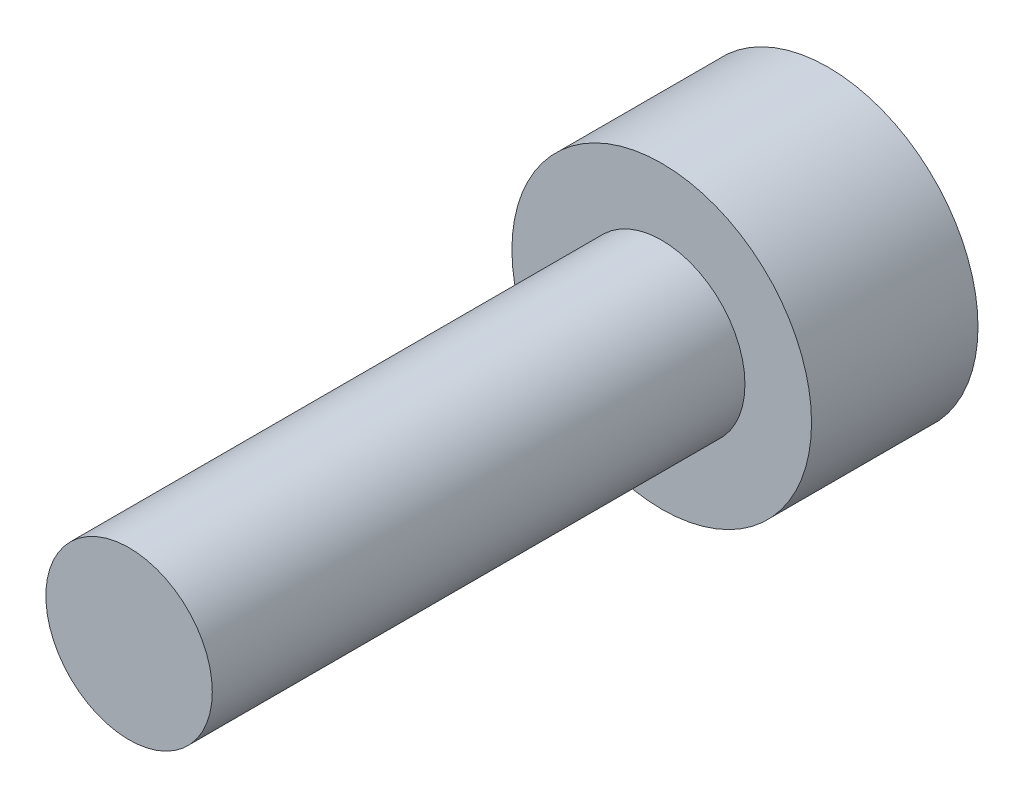
ISO-10303-21;
HEADER;
FILE_DESCRIPTION(('STEP AP214'),'2;1');
FILE_NAME('part.step','',(''),(''),'','','');
FILE_SCHEMA(('AUTOMOTIVE_DESIGN { 1 0 10303 214 1 1 1 1 }'));
ENDSEC;
DATA;
#1=APPLICATION_CONTEXT('core data for automotive mechanical design processes');
#2=APPLICATION_PROTOCOL_DEFINITION('international standard','automotive_design',2000,#1);
#3=PRODUCT_CONTEXT('',#1,'mechanical');
#4=PRODUCT('Part','Part','',(#3));
#5=PRODUCT_RELATED_PRODUCT_CATEGORY('part','',(#4));
#6=PRODUCT_DEFINITION_FORMATION('','',#4);
#7=PRODUCT_DEFINITION_CONTEXT('part definition',#1,'design');
#8=PRODUCT_DEFINITION('design','',#6,#7);
#9=PRODUCT_DEFINITION_SHAPE('','',#8);
#10=(LENGTH_UNIT() NAMED_UNIT(*) SI_UNIT(.MILLI.,.METRE.));
#11=(NAMED_UNIT(*) PLANE_ANGLE_UNIT() SI_UNIT($,.RADIAN.));
#12=(NAMED_UNIT(*) SI_UNIT($,.STERADIAN.) SOLID_ANGLE_UNIT());
#13=UNCERTAINTY_MEASURE_WITH_UNIT(LENGTH_MEASURE(1.E-05),#10,'distance_accuracy_value','');
#14=(GEOMETRIC_REPRESENTATION_CONTEXT(3) GLOBAL_UNCERTAINTY_ASSIGNED_CONTEXT((#13)) GLOBAL_UNIT_ASSIGNED_CONTEXT((#10,
#11,#12)) REPRESENTATION_CONTEXT('',''));
#15=CARTESIAN_POINT('',(0.,0.,0.));
#16=DIRECTION('',(0.,0.,1.));
#17=DIRECTION('',(1.,0.,0.));
#18=AXIS2_PLACEMENT_3D('',#15,#16,#17);
#19=CARTESIAN_POINT('',(0.,0.,2.5));
#20=DIRECTION('',(0.,0.,-1.));
#21=DIRECTION('',(-1.,0.,0.));
#22=AXIS2_PLACEMENT_3D('',#19,#20,#21);
#23=CYLINDRICAL_SURFACE('',#22,2.25);
#24=CARTESIAN_POINT('',(0.,0.,2.5));
#25=DIRECTION('',(0.,0.,1.));
#26=DIRECTION('',(1.,0.,0.));
#27=AXIS2_PLACEMENT_3D('',#24,#25,#26);
#28=CIRCLE('',#27,2.25);
#29=CARTESIAN_POINT('',(2.25,0.,2.5));
#30=VERTEX_POINT('',#29);
#31=EDGE_CURVE('E11',#30,#30,#28,.T.);
#32=ORIENTED_EDGE('',*,*,#31,.F.);
#33=EDGE_LOOP('',(#32));
#34=FACE_BOUND('',#33,.T.);
#35=CARTESIAN_POINT('',(0.,0.,0.));
#36=DIRECTION('',(0.,0.,1.));
#37=DIRECTION('',(1.,0.,0.));
#38=AXIS2_PLACEMENT_3D('',#35,#36,#37);
#39=CIRCLE('',#38,2.25);
#40=CARTESIAN_POINT('',(2.25,0.,0.));
#41=VERTEX_POINT('',#40);
#42=EDGE_CURVE('E39',#41,#41,#39,.T.);
#43=ORIENTED_EDGE('',*,*,#42,.T.);
#44=EDGE_LOOP('',(#43));
#45=FACE_BOUND('',#44,.T.);
#46=ADVANCED_FACE('F36',(#34,#45),#23,.T.);
#47=CARTESIAN_POINT('',(0.,0.,2.5));
#48=DIRECTION('',(0.,0.,1.));
#49=DIRECTION('',(1.,0.,0.));
#50=AXIS2_PLACEMENT_3D('',#47,#48,#49);
#51=PLANE('',#50);
#52=CARTESIAN_POINT('',(0.,0.,2.5));
#53=DIRECTION('',(0.,0.,1.));
#54=DIRECTION('',(1.,0.,0.));
#55=AXIS2_PLACEMENT_3D('',#52,#53,#54);
#56=CIRCLE('',#55,1.25);
#57=CARTESIAN_POINT('',(1.25,0.,2.5));
#58=VERTEX_POINT('',#57);
#59=EDGE_CURVE('E137',#58,#58,#56,.T.);
#60=ORIENTED_EDGE('',*,*,#59,.F.);
#61=EDGE_LOOP('',(#60));
#62=FACE_BOUND('',#61,.T.);
#63=ORIENTED_EDGE('',*,*,#31,.T.);
#64=EDGE_LOOP('',(#63));
#65=FACE_BOUND('',#64,.T.);
#66=ADVANCED_FACE('F151',(#62,#65),#51,.T.);
#67=CARTESIAN_POINT('',(0.,0.,0.));
#68=DIRECTION('',(0.,0.,1.));
#69=DIRECTION('',(1.,0.,0.));
#70=AXIS2_PLACEMENT_3D('',#67,#68,#69);
#71=PLANE('',#70);
#72=DIRECTION('',(0.5,0.866025403784438,0.));
#73=VECTOR('',#72,1.);
#74=CARTESIAN_POINT('',(-1.15470053837925,0.,0.));
#75=LINE('',#74,#73);
#76=CARTESIAN_POINT('',(-1.15470053837925,0.,0.));
#77=VERTEX_POINT('',#76);
#78=CARTESIAN_POINT('',(-0.577350269189626,1.,0.));
#79=VERTEX_POINT('',#78);
#80=EDGE_CURVE('E124',#77,#79,#75,.T.);
#81=ORIENTED_EDGE('',*,*,#80,.F.);
#82=DIRECTION('',(-0.5,0.866025403784439,0.));
#83=VECTOR('',#82,1.);
#84=CARTESIAN_POINT('',(-0.577350269189626,-1.,0.));
#85=LINE('',#84,#83);
#86=CARTESIAN_POINT('',(-0.577350269189626,-1.,0.));
#87=VERTEX_POINT('',#86);
#88=EDGE_CURVE('E50',#87,#77,#85,.T.);
#89=ORIENTED_EDGE('',*,*,#88,.F.);
#90=DIRECTION('',(-1.,0.,0.));
#91=VECTOR('',#90,1.);
#92=CARTESIAN_POINT('',(0.577350269189626,-1.,0.));
#93=LINE('',#92,#91);
#94=CARTESIAN_POINT('',(0.577350269189626,-1.,0.));
#95=VERTEX_POINT('',#94);
#96=EDGE_CURVE('E133',#95,#87,#93,.T.);
#97=ORIENTED_EDGE('',*,*,#96,.F.);
#98=DIRECTION('',(-0.5,-0.866025403784438,0.));
#99=VECTOR('',#98,1.);
#100=CARTESIAN_POINT('',(1.15470053837925,0.,0.));
#101=LINE('',#100,#99);
#102=CARTESIAN_POINT('',(1.15470053837925,0.,0.));
#103=VERTEX_POINT('',#102);
#104=EDGE_CURVE('E131',#103,#95,#101,.T.);
#105=ORIENTED_EDGE('',*,*,#104,.F.);
#106=DIRECTION('',(0.5,-0.866025403784439,0.));
#107=VECTOR('',#106,1.);
#108=CARTESIAN_POINT('',(0.577350269189626,1.,0.));
#109=LINE('',#108,#107);
#110=CARTESIAN_POINT('',(0.577350269189626,1.,0.));
#111=VERTEX_POINT('',#110);
#112=EDGE_CURVE('E98',#111,#103,#109,.T.);
#113=ORIENTED_EDGE('',*,*,#112,.F.);
#114=DIRECTION('',(1.,0.,0.));
#115=VECTOR('',#114,1.);
#116=CARTESIAN_POINT('',(-0.577350269189626,1.,0.));
#117=LINE('',#116,#115);
#118=EDGE_CURVE('E127',#79,#111,#117,.T.);
#119=ORIENTED_EDGE('',*,*,#118,.F.);
#120=EDGE_LOOP('',(#81,#89,#97,#105,#113,#119));
#121=FACE_BOUND('',#120,.T.);
#122=ORIENTED_EDGE('',*,*,#42,.F.);
#123=EDGE_LOOP('',(#122));
#124=FACE_BOUND('',#123,.T.);
#125=ADVANCED_FACE('F154',(#121,#124),#71,.F.);
#126=CARTESIAN_POINT('',(0.,0.,10.5));
#127=DIRECTION('',(0.,0.,-1.));
#128=DIRECTION('',(-1.,0.,0.));
#129=AXIS2_PLACEMENT_3D('',#126,#127,#128);
#130=CYLINDRICAL_SURFACE('',#129,1.25);
#131=CARTESIAN_POINT('',(0.,0.,10.5));
#132=DIRECTION('',(0.,0.,1.));
#133=DIRECTION('',(1.,0.,0.));
#134=AXIS2_PLACEMENT_3D('',#131,#132,#133);
#135=CIRCLE('',#134,1.25);
#136=CARTESIAN_POINT('',(1.25,0.,10.5));
#137=VERTEX_POINT('',#136);
#138=EDGE_CURVE('E143',#137,#137,#135,.T.);
#139=ORIENTED_EDGE('',*,*,#138,.F.);
#140=EDGE_LOOP('',(#139));
#141=FACE_BOUND('',#140,.T.);
#142=ORIENTED_EDGE('',*,*,#59,.T.);
#143=EDGE_LOOP('',(#142));
#144=FACE_BOUND('',#143,.T.);
#145=ADVANCED_FACE('F149',(#141,#144),#130,.T.);
#146=CARTESIAN_POINT('',(0.,0.,10.5));
#147=DIRECTION('',(0.,0.,1.));
#148=DIRECTION('',(1.,0.,0.));
#149=AXIS2_PLACEMENT_3D('',#146,#147,#148);
#150=PLANE('',#149);
#151=ORIENTED_EDGE('',*,*,#138,.T.);
#152=EDGE_LOOP('',(#151));
#153=FACE_BOUND('',#152,.T.);
#154=ADVANCED_FACE('F168',(#153),#150,.T.);
#155=CARTESIAN_POINT('',(-0.577350269189626,-1.,1.));
#156=DIRECTION('',(-0.866025403784439,-0.5,0.));
#157=DIRECTION('',(0.5,-0.866025403784439,0.));
#158=AXIS2_PLACEMENT_3D('',#155,#156,#157);
#159=PLANE('',#158);
#160=ORIENTED_EDGE('',*,*,#88,.T.);
#161=DIRECTION('',(0.,0.,-1.));
#162=VECTOR('',#161,1.);
#163=CARTESIAN_POINT('',(-1.15470053837925,0.,1.));
#164=LINE('',#163,#162);
#165=CARTESIAN_POINT('',(-1.15470053837925,0.,1.));
#166=VERTEX_POINT('',#165);
#167=EDGE_CURVE('E80',#166,#77,#164,.T.);
#168=ORIENTED_EDGE('',*,*,#167,.F.);
#169=DIRECTION('',(-0.5,0.866025403784439,0.));
#170=VECTOR('',#169,1.);
#171=CARTESIAN_POINT('',(-0.577350269189626,-1.,1.));
#172=LINE('',#171,#170);
#173=CARTESIAN_POINT('',(-0.577350269189626,-1.,1.));
#174=VERTEX_POINT('',#173);
#175=EDGE_CURVE('E135',#174,#166,#172,.T.);
#176=ORIENTED_EDGE('',*,*,#175,.F.);
#177=DIRECTION('',(0.,0.,-1.));
#178=VECTOR('',#177,1.);
#179=CARTESIAN_POINT('',(-0.577350269189626,-1.,1.));
#180=LINE('',#179,#178);
#181=EDGE_CURVE('E58',#174,#87,#180,.T.);
#182=ORIENTED_EDGE('',*,*,#181,.T.);
#183=EDGE_LOOP('',(#160,#168,#176,#182));
#184=FACE_BOUND('',#183,.T.);
#185=ADVANCED_FACE('F175',(#184),#159,.F.);
#186=CARTESIAN_POINT('',(0.577350269189626,-1.,1.));
#187=DIRECTION('',(0.,-1.,0.));
#188=DIRECTION('',(0.,0.,-1.));
#189=AXIS2_PLACEMENT_3D('',#186,#187,#188);
#190=PLANE('',#189);
#191=ORIENTED_EDGE('',*,*,#96,.T.);
#192=ORIENTED_EDGE('',*,*,#181,.F.);
#193=DIRECTION('',(-1.,0.,0.));
#194=VECTOR('',#193,1.);
#195=CARTESIAN_POINT('',(0.577350269189626,-1.,1.));
#196=LINE('',#195,#194);
#197=CARTESIAN_POINT('',(0.577350269189626,-1.,1.));
#198=VERTEX_POINT('',#197);
#199=EDGE_CURVE('E110',#198,#174,#196,.T.);
#200=ORIENTED_EDGE('',*,*,#199,.F.);
#201=DIRECTION('',(0.,0.,-1.));
#202=VECTOR('',#201,1.);
#203=CARTESIAN_POINT('',(0.577350269189626,-1.,1.));
#204=LINE('',#203,#202);
#205=EDGE_CURVE('E102',#198,#95,#204,.T.);
#206=ORIENTED_EDGE('',*,*,#205,.T.);
#207=EDGE_LOOP('',(#191,#192,#200,#206));
#208=FACE_BOUND('',#207,.T.);
#209=ADVANCED_FACE('F179',(#208),#190,.F.);
#210=CARTESIAN_POINT('',(1.15470053837925,0.,1.));
#211=DIRECTION('',(0.866025403784439,-0.5,0.));
#212=DIRECTION('',(0.5,0.866025403784439,0.));
#213=AXIS2_PLACEMENT_3D('',#210,#211,#212);
#214=PLANE('',#213);
#215=ORIENTED_EDGE('',*,*,#104,.T.);
#216=ORIENTED_EDGE('',*,*,#205,.F.);
#217=DIRECTION('',(-0.5,-0.866025403784438,0.));
#218=VECTOR('',#217,1.);
#219=CARTESIAN_POINT('',(1.15470053837925,0.,1.));
#220=LINE('',#219,#218);
#221=CARTESIAN_POINT('',(1.15470053837925,0.,1.));
#222=VERTEX_POINT('',#221);
#223=EDGE_CURVE('E106',#222,#198,#220,.T.);
#224=ORIENTED_EDGE('',*,*,#223,.F.);
#225=DIRECTION('',(0.,0.,-1.));
#226=VECTOR('',#225,1.);
#227=CARTESIAN_POINT('',(1.15470053837925,0.,1.));
#228=LINE('',#227,#226);
#229=EDGE_CURVE('E91',#222,#103,#228,.T.);
#230=ORIENTED_EDGE('',*,*,#229,.T.);
#231=EDGE_LOOP('',(#215,#216,#224,#230));
#232=FACE_BOUND('',#231,.T.);
#233=ADVANCED_FACE('F107',(#232),#214,.F.);
#234=CARTESIAN_POINT('',(0.577350269189626,1.,1.));
#235=DIRECTION('',(0.866025403784439,0.5,0.));
#236=DIRECTION('',(-0.5,0.866025403784439,0.));
#237=AXIS2_PLACEMENT_3D('',#234,#235,#236);
#238=PLANE('',#237);
#239=ORIENTED_EDGE('',*,*,#112,.T.);
#240=ORIENTED_EDGE('',*,*,#229,.F.);
#241=DIRECTION('',(0.5,-0.866025403784439,0.));
#242=VECTOR('',#241,1.);
#243=CARTESIAN_POINT('',(0.577350269189626,1.,1.));
#244=LINE('',#243,#242);
#245=CARTESIAN_POINT('',(0.577350269189626,1.,1.));
#246=VERTEX_POINT('',#245);
#247=EDGE_CURVE('E95',#246,#222,#244,.T.);
#248=ORIENTED_EDGE('',*,*,#247,.F.);
#249=DIRECTION('',(0.,0.,-1.));
#250=VECTOR('',#249,1.);
#251=CARTESIAN_POINT('',(0.577350269189626,1.,1.));
#252=LINE('',#251,#250);
#253=EDGE_CURVE('E103',#246,#111,#252,.T.);
#254=ORIENTED_EDGE('',*,*,#253,.T.);
#255=EDGE_LOOP('',(#239,#240,#248,#254));
#256=FACE_BOUND('',#255,.T.);
#257=ADVANCED_FACE('F93',(#256),#238,.F.);
#258=CARTESIAN_POINT('',(-0.577350269189626,1.,1.));
#259=DIRECTION('',(0.,1.,0.));
#260=DIRECTION('',(0.,0.,1.));
#261=AXIS2_PLACEMENT_3D('',#258,#259,#260);
#262=PLANE('',#261);
#263=ORIENTED_EDGE('',*,*,#118,.T.);
#264=ORIENTED_EDGE('',*,*,#253,.F.);
#265=DIRECTION('',(1.,0.,0.));
#266=VECTOR('',#265,1.);
#267=CARTESIAN_POINT('',(-0.577350269189626,1.,1.));
#268=LINE('',#267,#266);
#269=CARTESIAN_POINT('',(-0.577350269189626,1.,1.));
#270=VERTEX_POINT('',#269);
#271=EDGE_CURVE('E116',#270,#246,#268,.T.);
#272=ORIENTED_EDGE('',*,*,#271,.F.);
#273=DIRECTION('',(0.,0.,-1.));
#274=VECTOR('',#273,1.);
#275=CARTESIAN_POINT('',(-0.577350269189626,1.,1.));
#276=LINE('',#275,#274);
#277=EDGE_CURVE('E140',#270,#79,#276,.T.);
#278=ORIENTED_EDGE('',*,*,#277,.T.);
#279=EDGE_LOOP('',(#263,#264,#272,#278));
#280=FACE_BOUND('',#279,.T.);
#281=ADVANCED_FACE('F183',(#280),#262,.F.);
#282=CARTESIAN_POINT('',(-1.15470053837925,0.,1.));
#283=DIRECTION('',(-0.866025403784438,0.5,0.));
#284=DIRECTION('',(-0.5,-0.866025403784439,0.));
#285=AXIS2_PLACEMENT_3D('',#282,#283,#284);
#286=PLANE('',#285);
#287=ORIENTED_EDGE('',*,*,#80,.T.);
#288=ORIENTED_EDGE('',*,*,#277,.F.);
#289=DIRECTION('',(0.5,0.866025403784438,0.));
#290=VECTOR('',#289,1.);
#291=CARTESIAN_POINT('',(-1.15470053837925,0.,1.));
#292=LINE('',#291,#290);
#293=EDGE_CURVE('E118',#166,#270,#292,.T.);
#294=ORIENTED_EDGE('',*,*,#293,.F.);
#295=ORIENTED_EDGE('',*,*,#167,.T.);
#296=EDGE_LOOP('',(#287,#288,#294,#295));
#297=FACE_BOUND('',#296,.T.);
#298=ADVANCED_FACE('F180',(#297),#286,.F.);
#299=CARTESIAN_POINT('',(0.,0.,1.));
#300=DIRECTION('',(0.,0.,-1.));
#301=DIRECTION('',(-1.,0.,0.));
#302=AXIS2_PLACEMENT_3D('',#299,#300,#301);
#303=PLANE('',#302);
#304=ORIENTED_EDGE('',*,*,#175,.T.);
#305=ORIENTED_EDGE('',*,*,#293,.T.);
#306=ORIENTED_EDGE('',*,*,#271,.T.);
#307=ORIENTED_EDGE('',*,*,#247,.T.);
#308=ORIENTED_EDGE('',*,*,#223,.T.);
#309=ORIENTED_EDGE('',*,*,#199,.T.);
#310=EDGE_LOOP('',(#304,#305,#306,#307,#308,#309));
#311=FACE_BOUND('',#310,.T.);
#312=ADVANCED_FACE('F113',(#311),#303,.T.);
#313=CLOSED_SHELL('',(#46,#66,#125,#145,#154,#185,#209,#233,#257,#281,#298,#312));
#314=MANIFOLD_SOLID_BREP('B2',#313);
#315=ADVANCED_BREP_SHAPE_REPRESENTATION('',(#18,#314),#14);
#316=SHAPE_DEFINITION_REPRESENTATION(#9,#315);
ENDSEC;
END-ISO-10303-21;
